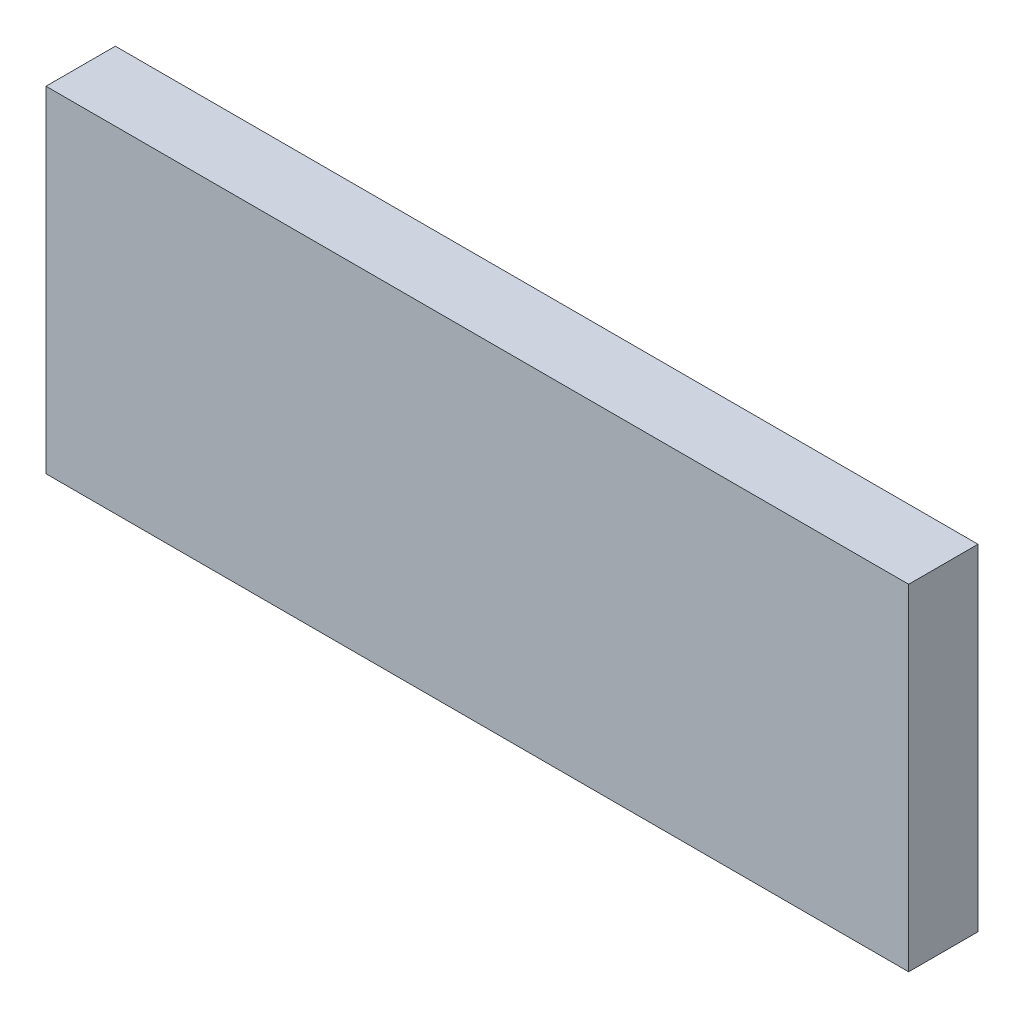
ISO-10303-21;
HEADER;
FILE_DESCRIPTION(('STEP AP214'),'2;1');
FILE_NAME('part.step','',(''),(''),'','','');
FILE_SCHEMA(('AUTOMOTIVE_DESIGN { 1 0 10303 214 1 1 1 1 }'));
ENDSEC;
DATA;
#1=APPLICATION_CONTEXT('core data for automotive mechanical design processes');
#2=APPLICATION_PROTOCOL_DEFINITION('international standard','automotive_design',2000,#1);
#3=PRODUCT_CONTEXT('',#1,'mechanical');
#4=PRODUCT('Part','Part','',(#3));
#5=PRODUCT_RELATED_PRODUCT_CATEGORY('part','',(#4));
#6=PRODUCT_DEFINITION_FORMATION('','',#4);
#7=PRODUCT_DEFINITION_CONTEXT('part definition',#1,'design');
#8=PRODUCT_DEFINITION('design','',#6,#7);
#9=PRODUCT_DEFINITION_SHAPE('','',#8);
#10=(LENGTH_UNIT() NAMED_UNIT(*) SI_UNIT(.MILLI.,.METRE.));
#11=(NAMED_UNIT(*) PLANE_ANGLE_UNIT() SI_UNIT($,.RADIAN.));
#12=(NAMED_UNIT(*) SI_UNIT($,.STERADIAN.) SOLID_ANGLE_UNIT());
#13=UNCERTAINTY_MEASURE_WITH_UNIT(LENGTH_MEASURE(1.E-05),#10,'distance_accuracy_value','');
#14=(GEOMETRIC_REPRESENTATION_CONTEXT(3) GLOBAL_UNCERTAINTY_ASSIGNED_CONTEXT((#13)) GLOBAL_UNIT_ASSIGNED_CONTEXT((#10,
#11,#12)) REPRESENTATION_CONTEXT('',''));
#15=CARTESIAN_POINT('',(0.,0.,0.));
#16=DIRECTION('',(0.,0.,1.));
#17=DIRECTION('',(1.,0.,0.));
#18=AXIS2_PLACEMENT_3D('',#15,#16,#17);
#19=CARTESIAN_POINT('',(0.,0.,6.35));
#20=DIRECTION('',(1.,0.,0.));
#21=DIRECTION('',(0.,0.,-1.));
#22=AXIS2_PLACEMENT_3D('',#19,#20,#21);
#23=PLANE('',#22);
#24=DIRECTION('',(0.,-1.,0.));
#25=VECTOR('',#24,1.);
#26=CARTESIAN_POINT('',(0.,0.,0.));
#27=LINE('',#26,#25);
#28=CARTESIAN_POINT('',(0.,30.734,0.));
#29=VERTEX_POINT('',#28);
#30=CARTESIAN_POINT('',(0.,0.,0.));
#31=VERTEX_POINT('',#30);
#32=EDGE_CURVE('E107',#29,#31,#27,.T.);
#33=ORIENTED_EDGE('',*,*,#32,.T.);
#34=DIRECTION('',(0.,0.,-1.));
#35=VECTOR('',#34,1.);
#36=CARTESIAN_POINT('',(0.,0.,6.35));
#37=LINE('',#36,#35);
#38=CARTESIAN_POINT('',(0.,0.,6.35));
#39=VERTEX_POINT('',#38);
#40=EDGE_CURVE('E11',#39,#31,#37,.T.);
#41=ORIENTED_EDGE('',*,*,#40,.F.);
#42=DIRECTION('',(0.,-1.,0.));
#43=VECTOR('',#42,1.);
#44=CARTESIAN_POINT('',(0.,0.,6.35));
#45=LINE('',#44,#43);
#46=CARTESIAN_POINT('',(0.,30.734,6.35));
#47=VERTEX_POINT('',#46);
#48=EDGE_CURVE('E91',#47,#39,#45,.T.);
#49=ORIENTED_EDGE('',*,*,#48,.F.);
#50=DIRECTION('',(0.,0.,-1.));
#51=VECTOR('',#50,1.);
#52=CARTESIAN_POINT('',(0.,30.734,6.35));
#53=LINE('',#52,#51);
#54=EDGE_CURVE('E103',#47,#29,#53,.T.);
#55=ORIENTED_EDGE('',*,*,#54,.T.);
#56=EDGE_LOOP('',(#33,#41,#49,#55));
#57=FACE_BOUND('',#56,.T.);
#58=ADVANCED_FACE('F39',(#57),#23,.F.);
#59=CARTESIAN_POINT('',(0.,0.,6.35));
#60=DIRECTION('',(0.,1.,0.));
#61=DIRECTION('',(0.,0.,1.));
#62=AXIS2_PLACEMENT_3D('',#59,#60,#61);
#63=PLANE('',#62);
#64=DIRECTION('',(1.,0.,0.));
#65=VECTOR('',#64,1.);
#66=CARTESIAN_POINT('',(0.,0.,0.));
#67=LINE('',#66,#65);
#68=CARTESIAN_POINT('',(78.994,0.,0.));
#69=VERTEX_POINT('',#68);
#70=EDGE_CURVE('E96',#31,#69,#67,.T.);
#71=ORIENTED_EDGE('',*,*,#70,.T.);
#72=DIRECTION('',(0.,0.,-1.));
#73=VECTOR('',#72,1.);
#74=CARTESIAN_POINT('',(78.994,0.,6.35));
#75=LINE('',#74,#73);
#76=CARTESIAN_POINT('',(78.994,0.,6.35));
#77=VERTEX_POINT('',#76);
#78=EDGE_CURVE('E48',#77,#69,#75,.T.);
#79=ORIENTED_EDGE('',*,*,#78,.F.);
#80=DIRECTION('',(1.,0.,0.));
#81=VECTOR('',#80,1.);
#82=CARTESIAN_POINT('',(0.,0.,6.35));
#83=LINE('',#82,#81);
#84=EDGE_CURVE('E86',#39,#77,#83,.T.);
#85=ORIENTED_EDGE('',*,*,#84,.F.);
#86=ORIENTED_EDGE('',*,*,#40,.T.);
#87=EDGE_LOOP('',(#71,#79,#85,#86));
#88=FACE_BOUND('',#87,.T.);
#89=ADVANCED_FACE('F95',(#88),#63,.F.);
#90=CARTESIAN_POINT('',(78.994,0.,6.35));
#91=DIRECTION('',(-1.,0.,0.));
#92=DIRECTION('',(0.,0.,1.));
#93=AXIS2_PLACEMENT_3D('',#90,#91,#92);
#94=PLANE('',#93);
#95=DIRECTION('',(0.,1.,0.));
#96=VECTOR('',#95,1.);
#97=CARTESIAN_POINT('',(78.994,0.,0.));
#98=LINE('',#97,#96);
#99=CARTESIAN_POINT('',(78.994,30.734,0.));
#100=VERTEX_POINT('',#99);
#101=EDGE_CURVE('E73',#69,#100,#98,.T.);
#102=ORIENTED_EDGE('',*,*,#101,.T.);
#103=DIRECTION('',(0.,0.,-1.));
#104=VECTOR('',#103,1.);
#105=CARTESIAN_POINT('',(78.994,30.734,6.35));
#106=LINE('',#105,#104);
#107=CARTESIAN_POINT('',(78.994,30.734,6.35));
#108=VERTEX_POINT('',#107);
#109=EDGE_CURVE('E98',#108,#100,#106,.T.);
#110=ORIENTED_EDGE('',*,*,#109,.F.);
#111=DIRECTION('',(0.,1.,0.));
#112=VECTOR('',#111,1.);
#113=CARTESIAN_POINT('',(78.994,0.,6.35));
#114=LINE('',#113,#112);
#115=EDGE_CURVE('E89',#77,#108,#114,.T.);
#116=ORIENTED_EDGE('',*,*,#115,.F.);
#117=ORIENTED_EDGE('',*,*,#78,.T.);
#118=EDGE_LOOP('',(#102,#110,#116,#117));
#119=FACE_BOUND('',#118,.T.);
#120=ADVANCED_FACE('F99',(#119),#94,.F.);
#121=CARTESIAN_POINT('',(0.,30.734,6.35));
#122=DIRECTION('',(0.,-1.,0.));
#123=DIRECTION('',(0.,0.,-1.));
#124=AXIS2_PLACEMENT_3D('',#121,#122,#123);
#125=PLANE('',#124);
#126=DIRECTION('',(-1.,0.,0.));
#127=VECTOR('',#126,1.);
#128=CARTESIAN_POINT('',(0.,30.734,0.));
#129=LINE('',#128,#127);
#130=EDGE_CURVE('E79',#100,#29,#129,.T.);
#131=ORIENTED_EDGE('',*,*,#130,.T.);
#132=ORIENTED_EDGE('',*,*,#54,.F.);
#133=DIRECTION('',(-1.,0.,0.));
#134=VECTOR('',#133,1.);
#135=CARTESIAN_POINT('',(0.,30.734,6.35));
#136=LINE('',#135,#134);
#137=EDGE_CURVE('E56',#108,#47,#136,.T.);
#138=ORIENTED_EDGE('',*,*,#137,.F.);
#139=ORIENTED_EDGE('',*,*,#109,.T.);
#140=EDGE_LOOP('',(#131,#132,#138,#139));
#141=FACE_BOUND('',#140,.T.);
#142=ADVANCED_FACE('F120',(#141),#125,.F.);
#143=CARTESIAN_POINT('',(0.,0.,6.35));
#144=DIRECTION('',(0.,0.,-1.));
#145=DIRECTION('',(-1.,0.,0.));
#146=AXIS2_PLACEMENT_3D('',#143,#144,#145);
#147=PLANE('',#146);
#148=ORIENTED_EDGE('',*,*,#48,.T.);
#149=ORIENTED_EDGE('',*,*,#84,.T.);
#150=ORIENTED_EDGE('',*,*,#115,.T.);
#151=ORIENTED_EDGE('',*,*,#137,.T.);
#152=EDGE_LOOP('',(#148,#149,#150,#151));
#153=FACE_BOUND('',#152,.T.);
#154=ADVANCED_FACE('F87',(#153),#147,.F.);
#155=CARTESIAN_POINT('',(0.,0.,0.));
#156=DIRECTION('',(0.,0.,-1.));
#157=DIRECTION('',(-1.,0.,0.));
#158=AXIS2_PLACEMENT_3D('',#155,#156,#157);
#159=PLANE('',#158);
#160=ORIENTED_EDGE('',*,*,#32,.F.);
#161=ORIENTED_EDGE('',*,*,#130,.F.);
#162=ORIENTED_EDGE('',*,*,#101,.F.);
#163=ORIENTED_EDGE('',*,*,#70,.F.);
#164=EDGE_LOOP('',(#160,#161,#162,#163));
#165=FACE_BOUND('',#164,.T.);
#166=ADVANCED_FACE('F123',(#165),#159,.T.);
#167=CLOSED_SHELL('',(#58,#89,#120,#142,#154,#166));
#168=MANIFOLD_SOLID_BREP('B2',#167);
#169=ADVANCED_BREP_SHAPE_REPRESENTATION('',(#18,#168),#14);
#170=SHAPE_DEFINITION_REPRESENTATION(#9,#169);
ENDSEC;
END-ISO-10303-21;
